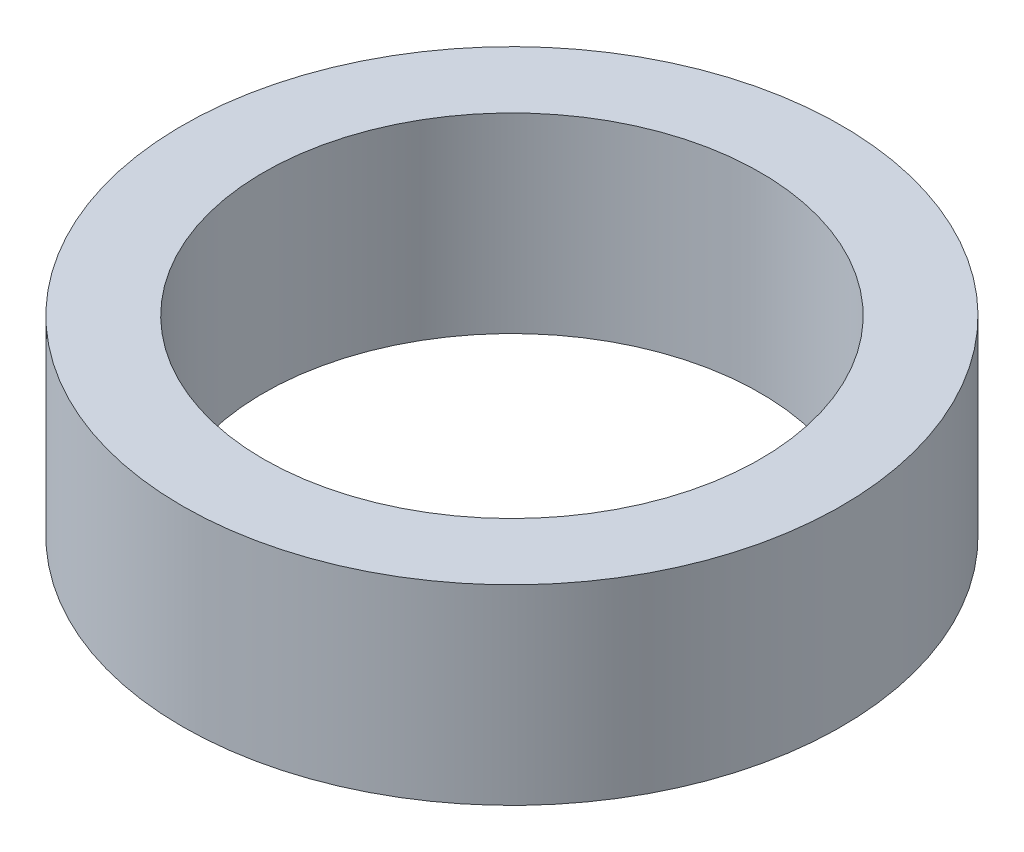
ISO-10303-21;
HEADER;
FILE_DESCRIPTION(('STEP AP214'),'2;1');
FILE_NAME('part.step','',(''),(''),'','','');
FILE_SCHEMA(('AUTOMOTIVE_DESIGN { 1 0 10303 214 1 1 1 1 }'));
ENDSEC;
DATA;
#1=APPLICATION_CONTEXT('core data for automotive mechanical design processes');
#2=APPLICATION_PROTOCOL_DEFINITION('international standard','automotive_design',2000,#1);
#3=PRODUCT_CONTEXT('',#1,'mechanical');
#4=PRODUCT('Part','Part','',(#3));
#5=PRODUCT_RELATED_PRODUCT_CATEGORY('part','',(#4));
#6=PRODUCT_DEFINITION_FORMATION('','',#4);
#7=PRODUCT_DEFINITION_CONTEXT('part definition',#1,'design');
#8=PRODUCT_DEFINITION('design','',#6,#7);
#9=PRODUCT_DEFINITION_SHAPE('','',#8);
#10=(LENGTH_UNIT() NAMED_UNIT(*) SI_UNIT(.MILLI.,.METRE.));
#11=(NAMED_UNIT(*) PLANE_ANGLE_UNIT() SI_UNIT($,.RADIAN.));
#12=(NAMED_UNIT(*) SI_UNIT($,.STERADIAN.) SOLID_ANGLE_UNIT());
#13=UNCERTAINTY_MEASURE_WITH_UNIT(LENGTH_MEASURE(1.E-05),#10,'distance_accuracy_value','');
#14=(GEOMETRIC_REPRESENTATION_CONTEXT(3) GLOBAL_UNCERTAINTY_ASSIGNED_CONTEXT((#13)) GLOBAL_UNIT_ASSIGNED_CONTEXT((#10,
#11,#12)) REPRESENTATION_CONTEXT('',''));
#15=CARTESIAN_POINT('',(0.,0.,0.));
#16=DIRECTION('',(0.,0.,1.));
#17=DIRECTION('',(1.,0.,0.));
#18=AXIS2_PLACEMENT_3D('',#15,#16,#17);
#19=CARTESIAN_POINT('',(0.,2.,0.));
#20=DIRECTION('',(0.,1.,0.));
#21=DIRECTION('',(0.,0.,1.));
#22=AXIS2_PLACEMENT_3D('',#19,#20,#21);
#23=PLANE('',#22);
#24=CARTESIAN_POINT('',(0.,2.,0.));
#25=DIRECTION('',(0.,1.,0.));
#26=DIRECTION('',(0.,0.,1.));
#27=AXIS2_PLACEMENT_3D('',#24,#25,#26);
#28=CIRCLE('',#27,3.45);
#29=CARTESIAN_POINT('',(0.,2.,3.45));
#30=VERTEX_POINT('',#29);
#31=EDGE_CURVE('E10',#30,#30,#28,.T.);
#32=ORIENTED_EDGE('',*,*,#31,.T.);
#33=EDGE_LOOP('',(#32));
#34=FACE_BOUND('',#33,.T.);
#35=CARTESIAN_POINT('',(0.,2.,0.));
#36=DIRECTION('',(0.,1.,0.));
#37=DIRECTION('',(0.,0.,1.));
#38=AXIS2_PLACEMENT_3D('',#35,#36,#37);
#39=CIRCLE('',#38,2.6);
#40=CARTESIAN_POINT('',(0.,2.,2.6));
#41=VERTEX_POINT('',#40);
#42=EDGE_CURVE('E41',#41,#41,#39,.T.);
#43=ORIENTED_EDGE('',*,*,#42,.F.);
#44=EDGE_LOOP('',(#43));
#45=FACE_BOUND('',#44,.T.);
#46=ADVANCED_FACE('F30',(#34,#45),#23,.T.);
#47=CARTESIAN_POINT('',(0.,0.,0.));
#48=DIRECTION('',(0.,1.,0.));
#49=DIRECTION('',(0.,0.,1.));
#50=AXIS2_PLACEMENT_3D('',#47,#48,#49);
#51=PLANE('',#50);
#52=CARTESIAN_POINT('',(0.,0.,0.));
#53=DIRECTION('',(0.,1.,0.));
#54=DIRECTION('',(0.,0.,1.));
#55=AXIS2_PLACEMENT_3D('',#52,#53,#54);
#56=CIRCLE('',#55,3.45);
#57=CARTESIAN_POINT('',(0.,0.,3.45));
#58=VERTEX_POINT('',#57);
#59=EDGE_CURVE('E34',#58,#58,#56,.T.);
#60=ORIENTED_EDGE('',*,*,#59,.F.);
#61=EDGE_LOOP('',(#60));
#62=FACE_BOUND('',#61,.T.);
#63=CARTESIAN_POINT('',(0.,0.,0.));
#64=DIRECTION('',(0.,1.,0.));
#65=DIRECTION('',(0.,0.,1.));
#66=AXIS2_PLACEMENT_3D('',#63,#64,#65);
#67=CIRCLE('',#66,2.6);
#68=CARTESIAN_POINT('',(0.,0.,2.6));
#69=VERTEX_POINT('',#68);
#70=EDGE_CURVE('E43',#69,#69,#67,.T.);
#71=ORIENTED_EDGE('',*,*,#70,.T.);
#72=EDGE_LOOP('',(#71));
#73=FACE_BOUND('',#72,.T.);
#74=ADVANCED_FACE('F53',(#62,#73),#51,.F.);
#75=CARTESIAN_POINT('',(0.,2.,0.));
#76=DIRECTION('',(0.,-1.,0.));
#77=DIRECTION('',(0.,0.,-1.));
#78=AXIS2_PLACEMENT_3D('',#75,#76,#77);
#79=CYLINDRICAL_SURFACE('',#78,3.45);
#80=ORIENTED_EDGE('',*,*,#31,.F.);
#81=EDGE_LOOP('',(#80));
#82=FACE_BOUND('',#81,.T.);
#83=ORIENTED_EDGE('',*,*,#59,.T.);
#84=EDGE_LOOP('',(#83));
#85=FACE_BOUND('',#84,.T.);
#86=ADVANCED_FACE('F32',(#82,#85),#79,.T.);
#87=CARTESIAN_POINT('',(0.,2.,0.));
#88=DIRECTION('',(0.,-1.,0.));
#89=DIRECTION('',(0.,0.,-1.));
#90=AXIS2_PLACEMENT_3D('',#87,#88,#89);
#91=CYLINDRICAL_SURFACE('',#90,2.6);
#92=ORIENTED_EDGE('',*,*,#42,.T.);
#93=EDGE_LOOP('',(#92));
#94=FACE_BOUND('',#93,.T.);
#95=ORIENTED_EDGE('',*,*,#70,.F.);
#96=EDGE_LOOP('',(#95));
#97=FACE_BOUND('',#96,.T.);
#98=ADVANCED_FACE('F49',(#94,#97),#91,.F.);
#99=CLOSED_SHELL('',(#46,#74,#86,#98));
#100=MANIFOLD_SOLID_BREP('B2',#99);
#101=ADVANCED_BREP_SHAPE_REPRESENTATION('',(#18,#100),#14);
#102=SHAPE_DEFINITION_REPRESENTATION(#9,#101);
ENDSEC;
END-ISO-10303-21;
